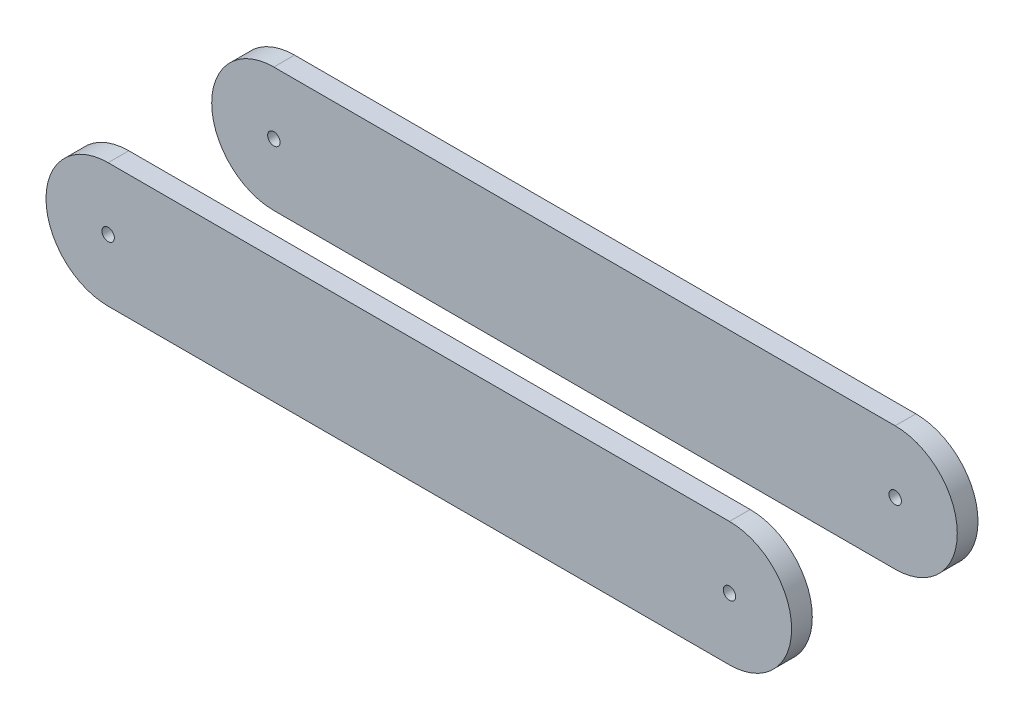
ISO-10303-21;
HEADER;
FILE_DESCRIPTION(('STEP AP214'),'2;1');
FILE_NAME('part.step','',(''),(''),'','','');
FILE_SCHEMA(('AUTOMOTIVE_DESIGN { 1 0 10303 214 1 1 1 1 }'));
ENDSEC;
DATA;
#1=APPLICATION_CONTEXT('core data for automotive mechanical design processes');
#2=APPLICATION_PROTOCOL_DEFINITION('international standard','automotive_design',2000,#1);
#3=PRODUCT_CONTEXT('',#1,'mechanical');
#4=PRODUCT('Part','Part','',(#3));
#5=PRODUCT_RELATED_PRODUCT_CATEGORY('part','',(#4));
#6=PRODUCT_DEFINITION_FORMATION('','',#4);
#7=PRODUCT_DEFINITION_CONTEXT('part definition',#1,'design');
#8=PRODUCT_DEFINITION('design','',#6,#7);
#9=PRODUCT_DEFINITION_SHAPE('','',#8);
#10=(LENGTH_UNIT() NAMED_UNIT(*) SI_UNIT(.MILLI.,.METRE.));
#11=(NAMED_UNIT(*) PLANE_ANGLE_UNIT() SI_UNIT($,.RADIAN.));
#12=(NAMED_UNIT(*) SI_UNIT($,.STERADIAN.) SOLID_ANGLE_UNIT());
#13=UNCERTAINTY_MEASURE_WITH_UNIT(LENGTH_MEASURE(1.E-05),#10,'distance_accuracy_value','');
#14=(GEOMETRIC_REPRESENTATION_CONTEXT(3) GLOBAL_UNCERTAINTY_ASSIGNED_CONTEXT((#13)) GLOBAL_UNIT_ASSIGNED_CONTEXT((#10,
#11,#12)) REPRESENTATION_CONTEXT('',''));
#15=CARTESIAN_POINT('',(0.,0.,0.));
#16=DIRECTION('',(0.,0.,1.));
#17=DIRECTION('',(1.,0.,0.));
#18=AXIS2_PLACEMENT_3D('',#15,#16,#17);
#19=CARTESIAN_POINT('',(-150.,0.,5.));
#20=DIRECTION('',(0.,0.,-1.));
#21=DIRECTION('',(-1.,0.,0.));
#22=AXIS2_PLACEMENT_3D('',#19,#20,#21);
#23=CYLINDRICAL_SURFACE('',#22,15.);
#24=CARTESIAN_POINT('',(-150.,0.,0.));
#25=DIRECTION('',(0.,0.,1.));
#26=DIRECTION('',(1.,0.,0.));
#27=AXIS2_PLACEMENT_3D('',#24,#25,#26);
#28=CIRCLE('',#27,15.);
#29=CARTESIAN_POINT('',(-150.,15.,0.));
#30=VERTEX_POINT('',#29);
#31=CARTESIAN_POINT('',(-150.,-15.,0.));
#32=VERTEX_POINT('',#31);
#33=EDGE_CURVE('P0_E79',#30,#32,#28,.T.);
#34=ORIENTED_EDGE('',*,*,#33,.T.);
#35=DIRECTION('',(0.,0.,-1.));
#36=VECTOR('',#35,1.);
#37=CARTESIAN_POINT('',(-150.,-15.,5.));
#38=LINE('',#37,#36);
#39=CARTESIAN_POINT('',(-150.,-15.,5.));
#40=VERTEX_POINT('',#39);
#41=EDGE_CURVE('P0_E11',#40,#32,#38,.T.);
#42=ORIENTED_EDGE('',*,*,#41,.F.);
#43=CARTESIAN_POINT('',(-150.,0.,5.));
#44=DIRECTION('',(0.,0.,1.));
#45=DIRECTION('',(1.,0.,0.));
#46=AXIS2_PLACEMENT_3D('',#43,#44,#45);
#47=CIRCLE('',#46,15.);
#48=CARTESIAN_POINT('',(-150.,15.,5.));
#49=VERTEX_POINT('',#48);
#50=EDGE_CURVE('P0_E67',#49,#40,#47,.T.);
#51=ORIENTED_EDGE('',*,*,#50,.F.);
#52=DIRECTION('',(0.,0.,-1.));
#53=VECTOR('',#52,1.);
#54=CARTESIAN_POINT('',(-150.,15.,5.));
#55=LINE('',#54,#53);
#56=EDGE_CURVE('P0_E75',#49,#30,#55,.T.);
#57=ORIENTED_EDGE('',*,*,#56,.T.);
#58=EDGE_LOOP('',(#34,#42,#51,#57));
#59=FACE_BOUND('',#58,.T.);
#60=ADVANCED_FACE('P0_F16',(#59),#23,.T.);
#61=CARTESIAN_POINT('',(-150.,-15.,5.));
#62=DIRECTION('',(0.,1.,0.));
#63=DIRECTION('',(0.,0.,1.));
#64=AXIS2_PLACEMENT_3D('',#61,#62,#63);
#65=PLANE('',#64);
#66=DIRECTION('',(1.,0.,0.));
#67=VECTOR('',#66,1.);
#68=CARTESIAN_POINT('',(-150.,-15.,0.));
#69=LINE('',#68,#67);
#70=CARTESIAN_POINT('',(0.,-15.,0.));
#71=VERTEX_POINT('',#70);
#72=EDGE_CURVE('P0_E71',#32,#71,#69,.T.);
#73=ORIENTED_EDGE('',*,*,#72,.T.);
#74=DIRECTION('',(0.,0.,-1.));
#75=VECTOR('',#74,1.);
#76=CARTESIAN_POINT('',(0.,-15.,5.));
#77=LINE('',#76,#75);
#78=CARTESIAN_POINT('',(0.,-15.,5.));
#79=VERTEX_POINT('',#78);
#80=EDGE_CURVE('P0_E24',#79,#71,#77,.T.);
#81=ORIENTED_EDGE('',*,*,#80,.F.);
#82=DIRECTION('',(1.,0.,0.));
#83=VECTOR('',#82,1.);
#84=CARTESIAN_POINT('',(-150.,-15.,5.));
#85=LINE('',#84,#83);
#86=EDGE_CURVE('P0_E62',#40,#79,#85,.T.);
#87=ORIENTED_EDGE('',*,*,#86,.F.);
#88=ORIENTED_EDGE('',*,*,#41,.T.);
#89=EDGE_LOOP('',(#73,#81,#87,#88));
#90=FACE_BOUND('',#89,.T.);
#91=ADVANCED_FACE('P0_F70',(#90),#65,.F.);
#92=CARTESIAN_POINT('',(0.,0.,5.));
#93=DIRECTION('',(0.,0.,-1.));
#94=DIRECTION('',(-1.,0.,0.));
#95=AXIS2_PLACEMENT_3D('',#92,#93,#94);
#96=CYLINDRICAL_SURFACE('',#95,15.);
#97=CARTESIAN_POINT('',(0.,0.,0.));
#98=DIRECTION('',(0.,0.,1.));
#99=DIRECTION('',(1.,0.,0.));
#100=AXIS2_PLACEMENT_3D('',#97,#98,#99);
#101=CIRCLE('',#100,15.);
#102=CARTESIAN_POINT('',(0.,15.,0.));
#103=VERTEX_POINT('',#102);
#104=EDGE_CURVE('P0_E49',#71,#103,#101,.T.);
#105=ORIENTED_EDGE('',*,*,#104,.T.);
#106=DIRECTION('',(0.,0.,-1.));
#107=VECTOR('',#106,1.);
#108=CARTESIAN_POINT('',(0.,15.,5.));
#109=LINE('',#108,#107);
#110=CARTESIAN_POINT('',(0.,15.,5.));
#111=VERTEX_POINT('',#110);
#112=EDGE_CURVE('P0_E72',#111,#103,#109,.T.);
#113=ORIENTED_EDGE('',*,*,#112,.F.);
#114=CARTESIAN_POINT('',(0.,0.,5.));
#115=DIRECTION('',(0.,0.,1.));
#116=DIRECTION('',(1.,0.,0.));
#117=AXIS2_PLACEMENT_3D('',#114,#115,#116);
#118=CIRCLE('',#117,15.);
#119=EDGE_CURVE('P0_E65',#79,#111,#118,.T.);
#120=ORIENTED_EDGE('',*,*,#119,.F.);
#121=ORIENTED_EDGE('',*,*,#80,.T.);
#122=EDGE_LOOP('',(#105,#113,#120,#121));
#123=FACE_BOUND('',#122,.T.);
#124=ADVANCED_FACE('P0_F73',(#123),#96,.T.);
#125=CARTESIAN_POINT('',(-150.,15.,5.));
#126=DIRECTION('',(0.,-1.,0.));
#127=DIRECTION('',(0.,0.,-1.));
#128=AXIS2_PLACEMENT_3D('',#125,#126,#127);
#129=PLANE('',#128);
#130=DIRECTION('',(-1.,0.,0.));
#131=VECTOR('',#130,1.);
#132=CARTESIAN_POINT('',(-150.,15.,0.));
#133=LINE('',#132,#131);
#134=EDGE_CURVE('P0_E55',#103,#30,#133,.T.);
#135=ORIENTED_EDGE('',*,*,#134,.T.);
#136=ORIENTED_EDGE('',*,*,#56,.F.);
#137=DIRECTION('',(-1.,0.,0.));
#138=VECTOR('',#137,1.);
#139=CARTESIAN_POINT('',(-150.,15.,5.));
#140=LINE('',#139,#138);
#141=EDGE_CURVE('P0_E32',#111,#49,#140,.T.);
#142=ORIENTED_EDGE('',*,*,#141,.F.);
#143=ORIENTED_EDGE('',*,*,#112,.T.);
#144=EDGE_LOOP('',(#135,#136,#142,#143));
#145=FACE_BOUND('',#144,.T.);
#146=ADVANCED_FACE('P0_F87',(#145),#129,.F.);
#147=CARTESIAN_POINT('',(-150.,0.,5.));
#148=DIRECTION('',(0.,0.,1.));
#149=DIRECTION('',(1.,0.,0.));
#150=AXIS2_PLACEMENT_3D('',#147,#148,#149);
#151=PLANE('',#150);
#152=CARTESIAN_POINT('',(-150.,0.,5.));
#153=DIRECTION('',(0.,0.,-1.));
#154=DIRECTION('',(-1.,0.,0.));
#155=AXIS2_PLACEMENT_3D('',#152,#153,#154);
#156=CIRCLE('',#155,1.5);
#157=CARTESIAN_POINT('',(-151.5,0.,5.));
#158=VERTEX_POINT('',#157);
#159=EDGE_CURVE('P0_E82',#158,#158,#156,.T.);
#160=ORIENTED_EDGE('',*,*,#159,.T.);
#161=EDGE_LOOP('',(#160));
#162=FACE_BOUND('',#161,.T.);
#163=CARTESIAN_POINT('',(0.,0.,5.));
#164=DIRECTION('',(0.,0.,-1.));
#165=DIRECTION('',(-1.,0.,0.));
#166=AXIS2_PLACEMENT_3D('',#163,#164,#165);
#167=CIRCLE('',#166,1.5);
#168=CARTESIAN_POINT('',(-1.49999999999998,0.,5.));
#169=VERTEX_POINT('',#168);
#170=EDGE_CURVE('P0_E96',#169,#169,#167,.T.);
#171=ORIENTED_EDGE('',*,*,#170,.T.);
#172=EDGE_LOOP('',(#171));
#173=FACE_BOUND('',#172,.T.);
#174=ORIENTED_EDGE('',*,*,#50,.T.);
#175=ORIENTED_EDGE('',*,*,#86,.T.);
#176=ORIENTED_EDGE('',*,*,#119,.T.);
#177=ORIENTED_EDGE('',*,*,#141,.T.);
#178=EDGE_LOOP('',(#174,#175,#176,#177));
#179=FACE_BOUND('',#178,.T.);
#180=ADVANCED_FACE('P0_F63',(#162,#173,#179),#151,.T.);
#181=CARTESIAN_POINT('',(-150.,0.,0.));
#182=DIRECTION('',(0.,0.,1.));
#183=DIRECTION('',(1.,0.,0.));
#184=AXIS2_PLACEMENT_3D('',#181,#182,#183);
#185=PLANE('',#184);
#186=CARTESIAN_POINT('',(-150.,0.,0.));
#187=DIRECTION('',(0.,0.,-1.));
#188=DIRECTION('',(-1.,0.,0.));
#189=AXIS2_PLACEMENT_3D('',#186,#187,#188);
#190=CIRCLE('',#189,1.5);
#191=CARTESIAN_POINT('',(-151.5,0.,0.));
#192=VERTEX_POINT('',#191);
#193=EDGE_CURVE('P0_E99',#192,#192,#190,.T.);
#194=ORIENTED_EDGE('',*,*,#193,.F.);
#195=EDGE_LOOP('',(#194));
#196=FACE_BOUND('',#195,.T.);
#197=CARTESIAN_POINT('',(0.,0.,0.));
#198=DIRECTION('',(0.,0.,-1.));
#199=DIRECTION('',(-1.,0.,0.));
#200=AXIS2_PLACEMENT_3D('',#197,#198,#199);
#201=CIRCLE('',#200,1.5);
#202=CARTESIAN_POINT('',(-1.49999999999998,0.,0.));
#203=VERTEX_POINT('',#202);
#204=EDGE_CURVE('P0_E93',#203,#203,#201,.T.);
#205=ORIENTED_EDGE('',*,*,#204,.F.);
#206=EDGE_LOOP('',(#205));
#207=FACE_BOUND('',#206,.T.);
#208=ORIENTED_EDGE('',*,*,#33,.F.);
#209=ORIENTED_EDGE('',*,*,#134,.F.);
#210=ORIENTED_EDGE('',*,*,#104,.F.);
#211=ORIENTED_EDGE('',*,*,#72,.F.);
#212=EDGE_LOOP('',(#208,#209,#210,#211));
#213=FACE_BOUND('',#212,.T.);
#214=ADVANCED_FACE('P0_F90',(#196,#207,#213),#185,.F.);
#215=CARTESIAN_POINT('',(0.,0.,5.));
#216=DIRECTION('',(0.,0.,-1.));
#217=DIRECTION('',(-1.,0.,0.));
#218=AXIS2_PLACEMENT_3D('',#215,#216,#217);
#219=CYLINDRICAL_SURFACE('',#218,1.5);
#220=ORIENTED_EDGE('',*,*,#170,.F.);
#221=EDGE_LOOP('',(#220));
#222=FACE_BOUND('',#221,.T.);
#223=ORIENTED_EDGE('',*,*,#204,.T.);
#224=EDGE_LOOP('',(#223));
#225=FACE_BOUND('',#224,.T.);
#226=ADVANCED_FACE('P0_F110',(#222,#225),#219,.F.);
#227=CARTESIAN_POINT('',(-150.,0.,5.));
#228=DIRECTION('',(0.,0.,-1.));
#229=DIRECTION('',(-1.,0.,0.));
#230=AXIS2_PLACEMENT_3D('',#227,#228,#229);
#231=CYLINDRICAL_SURFACE('',#230,1.5);
#232=ORIENTED_EDGE('',*,*,#159,.F.);
#233=EDGE_LOOP('',(#232));
#234=FACE_BOUND('',#233,.T.);
#235=ORIENTED_EDGE('',*,*,#193,.T.);
#236=EDGE_LOOP('',(#235));
#237=FACE_BOUND('',#236,.T.);
#238=ADVANCED_FACE('P0_F107',(#234,#237),#231,.F.);
#239=CLOSED_SHELL('',(#60,#91,#124,#146,#180,#214,#226,#238));
#240=MANIFOLD_SOLID_BREP('P0_B1',#239);
#241=CARTESIAN_POINT('',(-150.,0.,45.));
#242=DIRECTION('',(0.,0.,-1.));
#243=DIRECTION('',(-1.,0.,0.));
#244=AXIS2_PLACEMENT_3D('',#241,#242,#243);
#245=CYLINDRICAL_SURFACE('',#244,15.);
#246=CARTESIAN_POINT('',(-150.,0.,40.));
#247=DIRECTION('',(0.,0.,1.));
#248=DIRECTION('',(1.,0.,0.));
#249=AXIS2_PLACEMENT_3D('',#246,#247,#248);
#250=CIRCLE('',#249,15.);
#251=CARTESIAN_POINT('',(-150.,15.,40.));
#252=VERTEX_POINT('',#251);
#253=CARTESIAN_POINT('',(-150.,-15.,40.));
#254=VERTEX_POINT('',#253);
#255=EDGE_CURVE('P1_E79',#252,#254,#250,.T.);
#256=ORIENTED_EDGE('',*,*,#255,.T.);
#257=DIRECTION('',(0.,0.,-1.));
#258=VECTOR('',#257,1.);
#259=CARTESIAN_POINT('',(-150.,-15.,45.));
#260=LINE('',#259,#258);
#261=CARTESIAN_POINT('',(-150.,-15.,45.));
#262=VERTEX_POINT('',#261);
#263=EDGE_CURVE('P1_E11',#262,#254,#260,.T.);
#264=ORIENTED_EDGE('',*,*,#263,.F.);
#265=CARTESIAN_POINT('',(-150.,0.,45.));
#266=DIRECTION('',(0.,0.,1.));
#267=DIRECTION('',(1.,0.,0.));
#268=AXIS2_PLACEMENT_3D('',#265,#266,#267);
#269=CIRCLE('',#268,15.);
#270=CARTESIAN_POINT('',(-150.,15.,45.));
#271=VERTEX_POINT('',#270);
#272=EDGE_CURVE('P1_E67',#271,#262,#269,.T.);
#273=ORIENTED_EDGE('',*,*,#272,.F.);
#274=DIRECTION('',(0.,0.,-1.));
#275=VECTOR('',#274,1.);
#276=CARTESIAN_POINT('',(-150.,15.,45.));
#277=LINE('',#276,#275);
#278=EDGE_CURVE('P1_E75',#271,#252,#277,.T.);
#279=ORIENTED_EDGE('',*,*,#278,.T.);
#280=EDGE_LOOP('',(#256,#264,#273,#279));
#281=FACE_BOUND('',#280,.T.);
#282=ADVANCED_FACE('P1_F16',(#281),#245,.T.);
#283=CARTESIAN_POINT('',(-150.,-15.,45.));
#284=DIRECTION('',(0.,1.,0.));
#285=DIRECTION('',(0.,0.,1.));
#286=AXIS2_PLACEMENT_3D('',#283,#284,#285);
#287=PLANE('',#286);
#288=DIRECTION('',(1.,0.,0.));
#289=VECTOR('',#288,1.);
#290=CARTESIAN_POINT('',(-150.,-15.,40.));
#291=LINE('',#290,#289);
#292=CARTESIAN_POINT('',(0.,-15.,40.));
#293=VERTEX_POINT('',#292);
#294=EDGE_CURVE('P1_E71',#254,#293,#291,.T.);
#295=ORIENTED_EDGE('',*,*,#294,.T.);
#296=DIRECTION('',(0.,0.,-1.));
#297=VECTOR('',#296,1.);
#298=CARTESIAN_POINT('',(0.,-15.,45.));
#299=LINE('',#298,#297);
#300=CARTESIAN_POINT('',(0.,-15.,45.));
#301=VERTEX_POINT('',#300);
#302=EDGE_CURVE('P1_E24',#301,#293,#299,.T.);
#303=ORIENTED_EDGE('',*,*,#302,.F.);
#304=DIRECTION('',(1.,0.,0.));
#305=VECTOR('',#304,1.);
#306=CARTESIAN_POINT('',(-150.,-15.,45.));
#307=LINE('',#306,#305);
#308=EDGE_CURVE('P1_E62',#262,#301,#307,.T.);
#309=ORIENTED_EDGE('',*,*,#308,.F.);
#310=ORIENTED_EDGE('',*,*,#263,.T.);
#311=EDGE_LOOP('',(#295,#303,#309,#310));
#312=FACE_BOUND('',#311,.T.);
#313=ADVANCED_FACE('P1_F70',(#312),#287,.F.);
#314=CARTESIAN_POINT('',(0.,0.,45.));
#315=DIRECTION('',(0.,0.,-1.));
#316=DIRECTION('',(-1.,0.,0.));
#317=AXIS2_PLACEMENT_3D('',#314,#315,#316);
#318=CYLINDRICAL_SURFACE('',#317,15.);
#319=CARTESIAN_POINT('',(0.,0.,40.));
#320=DIRECTION('',(0.,0.,1.));
#321=DIRECTION('',(1.,0.,0.));
#322=AXIS2_PLACEMENT_3D('',#319,#320,#321);
#323=CIRCLE('',#322,15.);
#324=CARTESIAN_POINT('',(0.,15.,40.));
#325=VERTEX_POINT('',#324);
#326=EDGE_CURVE('P1_E49',#293,#325,#323,.T.);
#327=ORIENTED_EDGE('',*,*,#326,.T.);
#328=DIRECTION('',(0.,0.,-1.));
#329=VECTOR('',#328,1.);
#330=CARTESIAN_POINT('',(0.,15.,45.));
#331=LINE('',#330,#329);
#332=CARTESIAN_POINT('',(0.,15.,45.));
#333=VERTEX_POINT('',#332);
#334=EDGE_CURVE('P1_E72',#333,#325,#331,.T.);
#335=ORIENTED_EDGE('',*,*,#334,.F.);
#336=CARTESIAN_POINT('',(0.,0.,45.));
#337=DIRECTION('',(0.,0.,1.));
#338=DIRECTION('',(1.,0.,0.));
#339=AXIS2_PLACEMENT_3D('',#336,#337,#338);
#340=CIRCLE('',#339,15.);
#341=EDGE_CURVE('P1_E65',#301,#333,#340,.T.);
#342=ORIENTED_EDGE('',*,*,#341,.F.);
#343=ORIENTED_EDGE('',*,*,#302,.T.);
#344=EDGE_LOOP('',(#327,#335,#342,#343));
#345=FACE_BOUND('',#344,.T.);
#346=ADVANCED_FACE('P1_F73',(#345),#318,.T.);
#347=CARTESIAN_POINT('',(-150.,15.,45.));
#348=DIRECTION('',(0.,-1.,0.));
#349=DIRECTION('',(0.,0.,-1.));
#350=AXIS2_PLACEMENT_3D('',#347,#348,#349);
#351=PLANE('',#350);
#352=DIRECTION('',(-1.,0.,0.));
#353=VECTOR('',#352,1.);
#354=CARTESIAN_POINT('',(-150.,15.,40.));
#355=LINE('',#354,#353);
#356=EDGE_CURVE('P1_E55',#325,#252,#355,.T.);
#357=ORIENTED_EDGE('',*,*,#356,.T.);
#358=ORIENTED_EDGE('',*,*,#278,.F.);
#359=DIRECTION('',(-1.,0.,0.));
#360=VECTOR('',#359,1.);
#361=CARTESIAN_POINT('',(-150.,15.,45.));
#362=LINE('',#361,#360);
#363=EDGE_CURVE('P1_E32',#333,#271,#362,.T.);
#364=ORIENTED_EDGE('',*,*,#363,.F.);
#365=ORIENTED_EDGE('',*,*,#334,.T.);
#366=EDGE_LOOP('',(#357,#358,#364,#365));
#367=FACE_BOUND('',#366,.T.);
#368=ADVANCED_FACE('P1_F87',(#367),#351,.F.);
#369=CARTESIAN_POINT('',(-150.,0.,45.));
#370=DIRECTION('',(0.,0.,1.));
#371=DIRECTION('',(1.,0.,0.));
#372=AXIS2_PLACEMENT_3D('',#369,#370,#371);
#373=PLANE('',#372);
#374=CARTESIAN_POINT('',(-150.,0.,45.));
#375=DIRECTION('',(0.,0.,-1.));
#376=DIRECTION('',(-1.,0.,0.));
#377=AXIS2_PLACEMENT_3D('',#374,#375,#376);
#378=CIRCLE('',#377,1.5);
#379=CARTESIAN_POINT('',(-151.5,0.,45.));
#380=VERTEX_POINT('',#379);
#381=EDGE_CURVE('P1_E82',#380,#380,#378,.T.);
#382=ORIENTED_EDGE('',*,*,#381,.T.);
#383=EDGE_LOOP('',(#382));
#384=FACE_BOUND('',#383,.T.);
#385=CARTESIAN_POINT('',(0.,0.,45.));
#386=DIRECTION('',(0.,0.,-1.));
#387=DIRECTION('',(-1.,0.,0.));
#388=AXIS2_PLACEMENT_3D('',#385,#386,#387);
#389=CIRCLE('',#388,1.5);
#390=CARTESIAN_POINT('',(-1.49999999999998,0.,45.));
#391=VERTEX_POINT('',#390);
#392=EDGE_CURVE('P1_E96',#391,#391,#389,.T.);
#393=ORIENTED_EDGE('',*,*,#392,.T.);
#394=EDGE_LOOP('',(#393));
#395=FACE_BOUND('',#394,.T.);
#396=ORIENTED_EDGE('',*,*,#272,.T.);
#397=ORIENTED_EDGE('',*,*,#308,.T.);
#398=ORIENTED_EDGE('',*,*,#341,.T.);
#399=ORIENTED_EDGE('',*,*,#363,.T.);
#400=EDGE_LOOP('',(#396,#397,#398,#399));
#401=FACE_BOUND('',#400,.T.);
#402=ADVANCED_FACE('P1_F63',(#384,#395,#401),#373,.T.);
#403=CARTESIAN_POINT('',(-150.,0.,40.));
#404=DIRECTION('',(0.,0.,1.));
#405=DIRECTION('',(1.,0.,0.));
#406=AXIS2_PLACEMENT_3D('',#403,#404,#405);
#407=PLANE('',#406);
#408=CARTESIAN_POINT('',(-150.,0.,40.));
#409=DIRECTION('',(0.,0.,-1.));
#410=DIRECTION('',(-1.,0.,0.));
#411=AXIS2_PLACEMENT_3D('',#408,#409,#410);
#412=CIRCLE('',#411,1.5);
#413=CARTESIAN_POINT('',(-151.5,0.,40.));
#414=VERTEX_POINT('',#413);
#415=EDGE_CURVE('P1_E99',#414,#414,#412,.T.);
#416=ORIENTED_EDGE('',*,*,#415,.F.);
#417=EDGE_LOOP('',(#416));
#418=FACE_BOUND('',#417,.T.);
#419=CARTESIAN_POINT('',(0.,0.,40.));
#420=DIRECTION('',(0.,0.,-1.));
#421=DIRECTION('',(-1.,0.,0.));
#422=AXIS2_PLACEMENT_3D('',#419,#420,#421);
#423=CIRCLE('',#422,1.5);
#424=CARTESIAN_POINT('',(-1.49999999999998,0.,40.));
#425=VERTEX_POINT('',#424);
#426=EDGE_CURVE('P1_E93',#425,#425,#423,.T.);
#427=ORIENTED_EDGE('',*,*,#426,.F.);
#428=EDGE_LOOP('',(#427));
#429=FACE_BOUND('',#428,.T.);
#430=ORIENTED_EDGE('',*,*,#255,.F.);
#431=ORIENTED_EDGE('',*,*,#356,.F.);
#432=ORIENTED_EDGE('',*,*,#326,.F.);
#433=ORIENTED_EDGE('',*,*,#294,.F.);
#434=EDGE_LOOP('',(#430,#431,#432,#433));
#435=FACE_BOUND('',#434,.T.);
#436=ADVANCED_FACE('P1_F90',(#418,#429,#435),#407,.F.);
#437=CARTESIAN_POINT('',(0.,0.,45.));
#438=DIRECTION('',(0.,0.,-1.));
#439=DIRECTION('',(-1.,0.,0.));
#440=AXIS2_PLACEMENT_3D('',#437,#438,#439);
#441=CYLINDRICAL_SURFACE('',#440,1.5);
#442=ORIENTED_EDGE('',*,*,#392,.F.);
#443=EDGE_LOOP('',(#442));
#444=FACE_BOUND('',#443,.T.);
#445=ORIENTED_EDGE('',*,*,#426,.T.);
#446=EDGE_LOOP('',(#445));
#447=FACE_BOUND('',#446,.T.);
#448=ADVANCED_FACE('P1_F110',(#444,#447),#441,.F.);
#449=CARTESIAN_POINT('',(-150.,0.,45.));
#450=DIRECTION('',(0.,0.,-1.));
#451=DIRECTION('',(-1.,0.,0.));
#452=AXIS2_PLACEMENT_3D('',#449,#450,#451);
#453=CYLINDRICAL_SURFACE('',#452,1.5);
#454=ORIENTED_EDGE('',*,*,#381,.F.);
#455=EDGE_LOOP('',(#454));
#456=FACE_BOUND('',#455,.T.);
#457=ORIENTED_EDGE('',*,*,#415,.T.);
#458=EDGE_LOOP('',(#457));
#459=FACE_BOUND('',#458,.T.);
#460=ADVANCED_FACE('P1_F107',(#456,#459),#453,.F.);
#461=CLOSED_SHELL('',(#282,#313,#346,#368,#402,#436,#448,#460));
#462=MANIFOLD_SOLID_BREP('P1_B1',#461);
#463=ADVANCED_BREP_SHAPE_REPRESENTATION('',(#18,#240,#462),#14);
#464=SHAPE_DEFINITION_REPRESENTATION(#9,#463);
ENDSEC;
END-ISO-10303-21;
